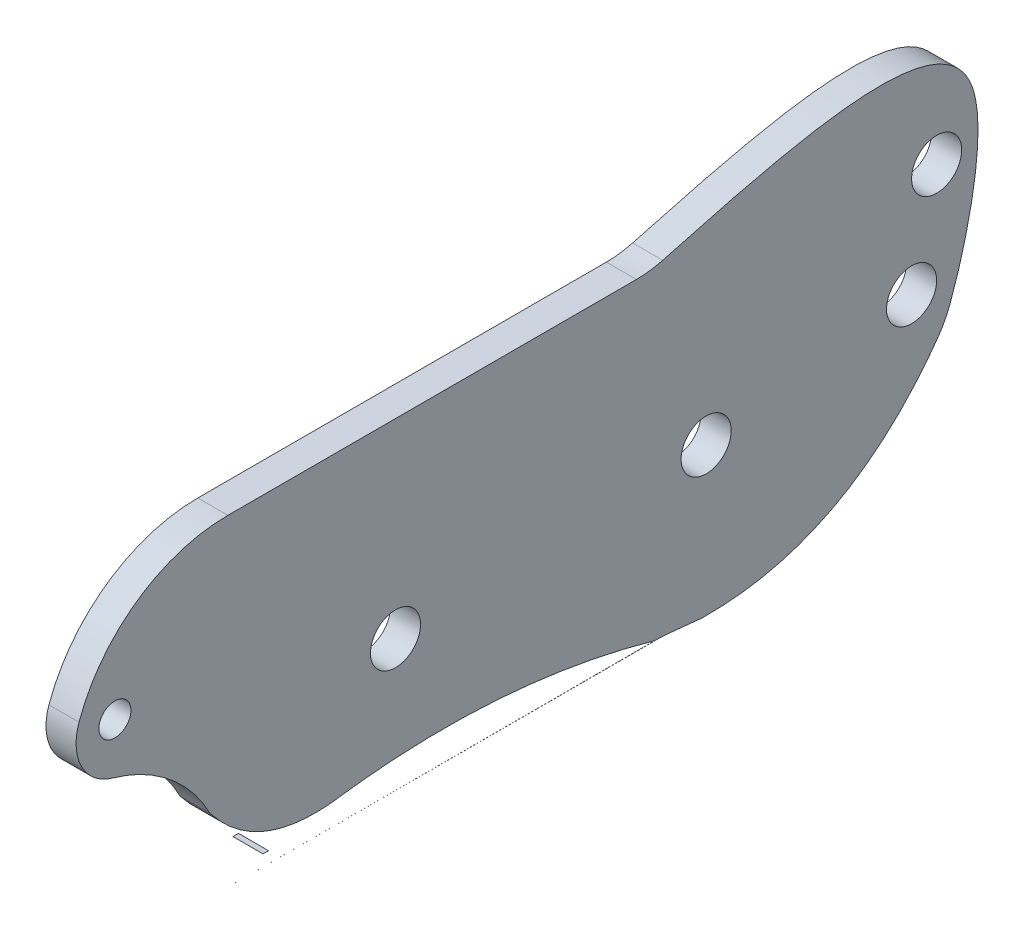
ISO-10303-21;
HEADER;
FILE_DESCRIPTION(('STEP AP214'),'2;1');
FILE_NAME('part.step','',(''),(''),'','','');
FILE_SCHEMA(('AUTOMOTIVE_DESIGN { 1 0 10303 214 1 1 1 1 }'));
ENDSEC;
DATA;
#1=APPLICATION_CONTEXT('core data for automotive mechanical design processes');
#2=APPLICATION_PROTOCOL_DEFINITION('international standard','automotive_design',2000,#1);
#3=PRODUCT_CONTEXT('',#1,'mechanical');
#4=PRODUCT('Part','Part','',(#3));
#5=PRODUCT_RELATED_PRODUCT_CATEGORY('part','',(#4));
#6=PRODUCT_DEFINITION_FORMATION('','',#4);
#7=PRODUCT_DEFINITION_CONTEXT('part definition',#1,'design');
#8=PRODUCT_DEFINITION('design','',#6,#7);
#9=PRODUCT_DEFINITION_SHAPE('','',#8);
#10=(LENGTH_UNIT() NAMED_UNIT(*) SI_UNIT(.MILLI.,.METRE.));
#11=(NAMED_UNIT(*) PLANE_ANGLE_UNIT() SI_UNIT($,.RADIAN.));
#12=(NAMED_UNIT(*) SI_UNIT($,.STERADIAN.) SOLID_ANGLE_UNIT());
#13=UNCERTAINTY_MEASURE_WITH_UNIT(LENGTH_MEASURE(1.E-05),#10,'distance_accuracy_value','');
#14=(GEOMETRIC_REPRESENTATION_CONTEXT(3) GLOBAL_UNCERTAINTY_ASSIGNED_CONTEXT((#13)) GLOBAL_UNIT_ASSIGNED_CONTEXT((#10,
#11,#12)) REPRESENTATION_CONTEXT('',''));
#15=CARTESIAN_POINT('',(0.,0.,0.));
#16=DIRECTION('',(0.,0.,1.));
#17=DIRECTION('',(1.,0.,0.));
#18=AXIS2_PLACEMENT_3D('',#15,#16,#17);
#19=CARTESIAN_POINT('',(3.,-32.1444743553119,1.14491749414469E-13));
#20=DIRECTION('',(-1.,0.,0.));
#21=DIRECTION('',(0.,0.,1.));
#22=AXIS2_PLACEMENT_3D('',#19,#20,#21);
#23=CYLINDRICAL_SURFACE('',#22,15.7821119433798);
#24=CARTESIAN_POINT('',(0.,-32.1444743553119,1.14491749414469E-13));
#25=DIRECTION('',(-1.,0.,0.));
#26=DIRECTION('',(0.,0.,-1.));
#27=AXIS2_PLACEMENT_3D('',#24,#25,#26);
#28=CIRCLE('',#27,15.7821119433798);
#29=CARTESIAN_POINT('',(0.,-16.9532882843979,-4.27819157498098));
#30=VERTEX_POINT('',#29);
#31=CARTESIAN_POINT('',(0.,-24.8780526474352,-14.0097884693762));
#32=VERTEX_POINT('',#31);
#33=EDGE_CURVE('E70',#30,#32,#28,.T.);
#34=ORIENTED_EDGE('',*,*,#33,.T.);
#35=DIRECTION('',(-1.,0.,0.));
#36=VECTOR('',#35,1.);
#37=CARTESIAN_POINT('',(3.00900035337785,-24.8780526474352,-14.0097884693762));
#38=LINE('',#37,#36);
#39=CARTESIAN_POINT('',(3.,-24.8780526474349,-14.0097884693759));
#40=VERTEX_POINT('',#39);
#41=EDGE_CURVE('E158',#32,#40,#38,.F.);
#42=ORIENTED_EDGE('',*,*,#41,.T.);
#43=CARTESIAN_POINT('',(3.,-32.1444743553119,1.14491749414469E-13));
#44=DIRECTION('',(-1.,0.,0.));
#45=DIRECTION('',(0.,0.,-1.));
#46=AXIS2_PLACEMENT_3D('',#43,#44,#45);
#47=CIRCLE('',#46,15.7821119433798);
#48=CARTESIAN_POINT('',(3.,-16.9532882843979,-4.27819157498098));
#49=VERTEX_POINT('',#48);
#50=EDGE_CURVE('E79',#49,#40,#47,.T.);
#51=ORIENTED_EDGE('',*,*,#50,.F.);
#52=DIRECTION('',(-1.,0.,0.));
#53=VECTOR('',#52,1.);
#54=CARTESIAN_POINT('',(3.,-16.9532882843979,-4.27819157498098));
#55=LINE('',#54,#53);
#56=EDGE_CURVE('E314',#49,#30,#55,.T.);
#57=ORIENTED_EDGE('',*,*,#56,.T.);
#58=EDGE_LOOP('',(#34,#42,#51,#57));
#59=FACE_BOUND('',#58,.T.);
#60=ADVANCED_FACE('F52',(#59),#23,.F.);
#61=CARTESIAN_POINT('',(0.,-32.1356776402174,-58.4113438615279));
#62=CARTESIAN_POINT('',(0.,-26.2601469590755,-37.6613027874173));
#63=CARTESIAN_POINT('',(0.,-32.1444743553118,-15.7821119433797));
#64=B_SPLINE_CURVE_WITH_KNOTS('',2,(#61,#62,#63),.UNSPECIFIED.,.F.,.F.,(3,3),(0.,1.),.UNSPECIFIED.);
#65=DIRECTION('',(1.,0.,0.));
#66=VECTOR('',#65,1.);
#67=SURFACE_OF_LINEAR_EXTRUSION('',#64,#66);
#68=CARTESIAN_POINT('',(3.,-32.1356776402174,-58.4113438615279));
#69=CARTESIAN_POINT('',(3.,-26.2601469590755,-37.6613027874173));
#70=CARTESIAN_POINT('',(3.,-32.1444743553118,-15.7821119433797));
#71=B_SPLINE_CURVE_WITH_KNOTS('',2,(#68,#69,#70),.UNSPECIFIED.,.F.,.F.,(3,3),(0.,1.),.UNSPECIFIED.);
#72=CARTESIAN_POINT('',(3.,-32.1356776402174,-58.4113438615279));
#73=VERTEX_POINT('',#72);
#74=CARTESIAN_POINT('',(3.,-29.8501550964413,-27.3101913273094));
#75=VERTEX_POINT('',#74);
#76=EDGE_CURVE('E152',#73,#75,#71,.T.);
#77=ORIENTED_EDGE('',*,*,#76,.T.);
#78=CARTESIAN_POINT('',(3.,-29.8501550964413,-27.3101913273094));
#79=CARTESIAN_POINT('',(3.,-29.910526915623,-26.8389903539469));
#80=CARTESIAN_POINT('',(3.,-29.9765056621349,-26.3672510185851));
#81=B_SPLINE_CURVE_WITH_KNOTS('',2,(#78,#79,#80),.UNSPECIFIED.,.F.,.F.,(3,3),(0.734735799910028,
0.756571213550189),.UNSPECIFIED.);
#82=CARTESIAN_POINT('',(3.,-29.9765056621349,-26.3672510185851));
#83=VERTEX_POINT('',#82);
#84=EDGE_CURVE('E148',#75,#83,#81,.T.);
#85=ORIENTED_EDGE('',*,*,#84,.T.);
#86=DIRECTION('',(-1.,0.,0.));
#87=VECTOR('',#86,1.);
#88=CARTESIAN_POINT('',(3.00900035337785,-29.9765056621349,-26.3672510185851));
#89=LINE('',#88,#87);
#90=CARTESIAN_POINT('',(0.,-29.9765056610089,-26.3672510266359));
#91=VERTEX_POINT('',#90);
#92=EDGE_CURVE('E157',#83,#91,#89,.T.);
#93=ORIENTED_EDGE('',*,*,#92,.T.);
#94=CARTESIAN_POINT('',(0.,-32.1356776402174,-58.4113438615279));
#95=VERTEX_POINT('',#94);
#96=EDGE_CURVE('E246',#95,#91,#64,.T.);
#97=ORIENTED_EDGE('',*,*,#96,.F.);
#98=DIRECTION('',(1.,0.,0.));
#99=VECTOR('',#98,1.);
#100=CARTESIAN_POINT('',(0.,-32.1356776402174,-58.4113438615279));
#101=LINE('',#100,#99);
#102=EDGE_CURVE('E163',#95,#73,#101,.T.);
#103=ORIENTED_EDGE('',*,*,#102,.T.);
#104=EDGE_LOOP('',(#77,#85,#93,#97,#103));
#105=FACE_BOUND('',#104,.T.);
#106=ADVANCED_FACE('F161',(#105),#67,.F.);
#107=CARTESIAN_POINT('',(3.,-16.3623624119322,-57.8844813533615));
#108=DIRECTION('',(1.,0.,0.));
#109=DIRECTION('',(0.,0.,-1.));
#110=AXIS2_PLACEMENT_3D('',#107,#108,#109);
#111=PLANE('',#110);
#112=CARTESIAN_POINT('',(3.,-15.0490269286293,-84.0097884693759));
#113=DIRECTION('',(1.,0.,0.));
#114=DIRECTION('',(0.,0.,-1.));
#115=AXIS2_PLACEMENT_3D('',#112,#113,#114);
#116=CIRCLE('',#115,2.49999999999999);
#117=CARTESIAN_POINT('',(3.,-15.0490269286293,-86.5097884693759));
#118=VERTEX_POINT('',#117);
#119=EDGE_CURVE('E279',#118,#118,#116,.T.);
#120=ORIENTED_EDGE('',*,*,#119,.F.);
#121=EDGE_LOOP('',(#120));
#122=FACE_BOUND('',#121,.T.);
#123=CARTESIAN_POINT('',(3.,-19.028525858928,-32.5097884693759));
#124=DIRECTION('',(1.,0.,0.));
#125=DIRECTION('',(0.,0.,-1.));
#126=AXIS2_PLACEMENT_3D('',#123,#124,#125);
#127=CIRCLE('',#126,2.5);
#128=CARTESIAN_POINT('',(3.,-19.028525858928,-35.0097884693759));
#129=VERTEX_POINT('',#128);
#130=EDGE_CURVE('E273',#129,#129,#127,.T.);
#131=ORIENTED_EDGE('',*,*,#130,.F.);
#132=EDGE_LOOP('',(#131));
#133=FACE_BOUND('',#132,.T.);
#134=CARTESIAN_POINT('',(3.,-17.778525858928,-63.5097884693759));
#135=DIRECTION('',(1.,0.,0.));
#136=DIRECTION('',(0.,0.,-1.));
#137=AXIS2_PLACEMENT_3D('',#134,#135,#136);
#138=CIRCLE('',#137,2.49999999999999);
#139=CARTESIAN_POINT('',(3.,-17.778525858928,-66.0097884693759));
#140=VERTEX_POINT('',#139);
#141=EDGE_CURVE('E265',#140,#140,#138,.T.);
#142=ORIENTED_EDGE('',*,*,#141,.F.);
#143=EDGE_LOOP('',(#142));
#144=FACE_BOUND('',#143,.T.);
#145=CARTESIAN_POINT('',(3.,-11.996404602197,-4.50978846937593));
#146=DIRECTION('',(1.,0.,0.));
#147=DIRECTION('',(0.,0.,-1.));
#148=AXIS2_PLACEMENT_3D('',#145,#146,#147);
#149=CIRCLE('',#148,1.6);
#150=CARTESIAN_POINT('',(3.,-11.996404602197,-6.10978846937593));
#151=VERTEX_POINT('',#150);
#152=EDGE_CURVE('E262',#151,#151,#149,.T.);
#153=ORIENTED_EDGE('',*,*,#152,.F.);
#154=EDGE_LOOP('',(#153));
#155=FACE_BOUND('',#154,.T.);
#156=CARTESIAN_POINT('',(3.,-5.02852585892804,-86.5097884693759));
#157=DIRECTION('',(1.,0.,0.));
#158=DIRECTION('',(0.,0.,-1.));
#159=AXIS2_PLACEMENT_3D('',#156,#157,#158);
#160=CIRCLE('',#159,2.5);
#161=CARTESIAN_POINT('',(3.,-5.02852585892804,-89.0097884693759));
#162=VERTEX_POINT('',#161);
#163=EDGE_CURVE('E251',#162,#162,#160,.T.);
#164=ORIENTED_EDGE('',*,*,#163,.F.);
#165=EDGE_LOOP('',(#164));
#166=FACE_BOUND('',#165,.T.);
#167=CARTESIAN_POINT('',(3.,-22.2448675699933,-12.2911693052142));
#168=CARTESIAN_POINT('',(3.,-31.4276918674506,-17.3411433747541));
#169=CARTESIAN_POINT('',(3.,-29.8501507899768,-27.3102249397086));
#170=B_SPLINE_CURVE_WITH_KNOTS('',2,(#167,#168,#169),.UNSPECIFIED.,.F.,.F.,(3,3),(0.,1.),.UNSPECIFIED.);
#171=EDGE_CURVE('E13',#83,#40,#170,.F.);
#172=ORIENTED_EDGE('',*,*,#171,.F.);
#173=ORIENTED_EDGE('',*,*,#84,.F.);
#174=ORIENTED_EDGE('',*,*,#76,.F.);
#175=CARTESIAN_POINT('',(3.,-42.1333095430407,-58.6289589704921));
#176=DIRECTION('',(1.,0.,0.));
#177=DIRECTION('',(0.,0.,-1.));
#178=AXIS2_PLACEMENT_3D('',#175,#176,#177);
#179=CIRCLE('',#178,10.);
#180=CARTESIAN_POINT('',(3.,-32.1895694838639,-59.6882198616429));
#181=VERTEX_POINT('',#180);
#182=EDGE_CURVE('E164',#73,#181,#179,.F.);
#183=ORIENTED_EDGE('',*,*,#182,.T.);
#184=CARTESIAN_POINT('',(3.,0.,-57.8844813533614));
#185=CARTESIAN_POINT('',(3.,3.96506314049984,-72.4697070885256));
#186=CARTESIAN_POINT('',(3.,9.39071824137526,-92.4276249332934));
#187=CARTESIAN_POINT('',(3.,-16.1793130097914,-89.6942745472634));
#188=CARTESIAN_POINT('',(3.,-34.4258267328282,-80.5564961166921));
#189=CARTESIAN_POINT('',(3.,-32.8270484479734,-65.6359901461603));
#190=CARTESIAN_POINT('',(3.,-32.1092973012512,-58.9376190390007));
#191=B_SPLINE_CURVE_WITH_KNOTS('',3,(#184,#185,#186,#187,#188,#189,#190),.UNSPECIFIED.,.F.,.F.,
(4,1,1,1,4),(0.,0.376783583733936,0.5155776088737,0.782524737781,1.),.UNSPECIFIED.);
#192=CARTESIAN_POINT('',(3.,-32.528525858928,-63.1029357809287));
#193=VERTEX_POINT('',#192);
#194=EDGE_CURVE('E187',#193,#181,#191,.T.);
#195=ORIENTED_EDGE('',*,*,#194,.F.);
#196=CARTESIAN_POINT('',(3.,-32.1356776402174,-58.4113438615279));
#197=CARTESIAN_POINT('',(3.,-34.8482096110882,-76.7305716450905));
#198=CARTESIAN_POINT('',(3.,-19.0176348210288,-87.3587036245105));
#199=B_SPLINE_CURVE_WITH_KNOTS('',2,(#196,#197,#198),.UNSPECIFIED.,.F.,.F.,(3,3),(0.,1.),.UNSPECIFIED.);
#200=CARTESIAN_POINT('',(3.,-20.1208711896773,-86.5925205196383));
#201=VERTEX_POINT('',#200);
#202=EDGE_CURVE('E166',#193,#201,#199,.T.);
#203=ORIENTED_EDGE('',*,*,#202,.T.);
#204=CARTESIAN_POINT('',(3.,-14.285250462083,-78.4718351591732));
#205=DIRECTION('',(1.,0.,0.));
#206=DIRECTION('',(0.,0.,-1.));
#207=AXIS2_PLACEMENT_3D('',#204,#205,#206);
#208=CIRCLE('',#207,10.);
#209=CARTESIAN_POINT('',(3.,-17.7649772351603,-87.8468819102422));
#210=VERTEX_POINT('',#209);
#211=EDGE_CURVE('E326',#201,#210,#208,.T.);
#212=ORIENTED_EDGE('',*,*,#211,.T.);
#213=CARTESIAN_POINT('',(3.,0.348966370012304,-59.168944813152));
#214=VERTEX_POINT('',#213);
#215=EDGE_CURVE('E176',#214,#210,#191,.T.);
#216=ORIENTED_EDGE('',*,*,#215,.F.);
#217=CARTESIAN_POINT('',(3.,10.,-56.5502524156287));
#218=DIRECTION('',(1.,0.,0.));
#219=DIRECTION('',(0.,0.,-1.));
#220=AXIS2_PLACEMENT_3D('',#217,#218,#219);
#221=CIRCLE('',#220,10.);
#222=CARTESIAN_POINT('',(3.,0.,-56.5502524156286));
#223=VERTEX_POINT('',#222);
#224=EDGE_CURVE('E357',#214,#223,#221,.F.);
#225=ORIENTED_EDGE('',*,*,#224,.T.);
#226=DIRECTION('',(0.,0.,1.));
#227=VECTOR('',#226,1.);
#228=CARTESIAN_POINT('',(3.,0.,-15.7821119433797));
#229=LINE('',#228,#227);
#230=CARTESIAN_POINT('',(3.,0.,-15.7821119433797));
#231=VERTEX_POINT('',#230);
#232=EDGE_CURVE('E356',#223,#231,#229,.T.);
#233=ORIENTED_EDGE('',*,*,#232,.T.);
#234=CARTESIAN_POINT('',(3.,-15.7821119433796,-15.7821119433796));
#235=DIRECTION('',(1.,0.,0.));
#236=DIRECTION('',(0.,0.,-1.));
#237=AXIS2_PLACEMENT_3D('',#234,#235,#236);
#238=CIRCLE('',#237,15.7821119433796);
#239=CARTESIAN_POINT('',(3.,-10.4517745719086,-0.92739683673199));
#240=VERTEX_POINT('',#239);
#241=EDGE_CURVE('E309',#231,#240,#238,.T.);
#242=ORIENTED_EDGE('',*,*,#241,.T.);
#243=CARTESIAN_POINT('',(3.,-12.1405020979185,-5.63358418350182));
#244=DIRECTION('',(1.,0.,0.));
#245=DIRECTION('',(0.,0.,-1.));
#246=AXIS2_PLACEMENT_3D('',#243,#244,#245);
#247=CIRCLE('',#246,5.);
#248=EDGE_CURVE('E307',#240,#49,#247,.T.);
#249=ORIENTED_EDGE('',*,*,#248,.T.);
#250=ORIENTED_EDGE('',*,*,#50,.T.);
#251=EDGE_LOOP('',(#172,#173,#174,#183,#195,#203,#212,#216,#225,#233,#242,#249,#250));
#252=FACE_BOUND('',#251,.T.);
#253=ADVANCED_FACE('F54',(#122,#133,#144,#155,#166,#252),#111,.T.);
#254=CARTESIAN_POINT('',(0.,-16.3623624119322,-57.8844813533615));
#255=DIRECTION('',(1.,0.,0.));
#256=DIRECTION('',(0.,0.,-1.));
#257=AXIS2_PLACEMENT_3D('',#254,#255,#256);
#258=PLANE('',#257);
#259=CARTESIAN_POINT('',(0.,-15.0490269286293,-84.0097884693759));
#260=DIRECTION('',(-1.,0.,0.));
#261=DIRECTION('',(0.,0.,1.));
#262=AXIS2_PLACEMENT_3D('',#259,#260,#261);
#263=CIRCLE('',#262,2.49999999999999);
#264=CARTESIAN_POINT('',(0.,-15.0490269286293,-81.5097884693759));
#265=VERTEX_POINT('',#264);
#266=EDGE_CURVE('E282',#265,#265,#263,.T.);
#267=ORIENTED_EDGE('',*,*,#266,.F.);
#268=EDGE_LOOP('',(#267));
#269=FACE_BOUND('',#268,.T.);
#270=CARTESIAN_POINT('',(0.,-19.028525858928,-32.5097884693759));
#271=DIRECTION('',(-1.,0.,0.));
#272=DIRECTION('',(0.,0.,1.));
#273=AXIS2_PLACEMENT_3D('',#270,#271,#272);
#274=CIRCLE('',#273,2.5);
#275=CARTESIAN_POINT('',(0.,-19.028525858928,-30.0097884693759));
#276=VERTEX_POINT('',#275);
#277=EDGE_CURVE('E276',#276,#276,#274,.T.);
#278=ORIENTED_EDGE('',*,*,#277,.F.);
#279=EDGE_LOOP('',(#278));
#280=FACE_BOUND('',#279,.T.);
#281=CARTESIAN_POINT('',(0.,-17.778525858928,-63.5097884693759));
#282=DIRECTION('',(-1.,0.,0.));
#283=DIRECTION('',(0.,0.,1.));
#284=AXIS2_PLACEMENT_3D('',#281,#282,#283);
#285=CIRCLE('',#284,2.49999999999999);
#286=CARTESIAN_POINT('',(0.,-17.778525858928,-61.0097884693759));
#287=VERTEX_POINT('',#286);
#288=EDGE_CURVE('E270',#287,#287,#285,.T.);
#289=ORIENTED_EDGE('',*,*,#288,.F.);
#290=EDGE_LOOP('',(#289));
#291=FACE_BOUND('',#290,.T.);
#292=CARTESIAN_POINT('',(0.,-11.996404602197,-4.50978846937593));
#293=DIRECTION('',(1.,0.,0.));
#294=DIRECTION('',(0.,0.,-1.));
#295=AXIS2_PLACEMENT_3D('',#292,#293,#294);
#296=CIRCLE('',#295,1.6);
#297=CARTESIAN_POINT('',(0.,-11.996404602197,-6.10978846937593));
#298=VERTEX_POINT('',#297);
#299=EDGE_CURVE('E261',#298,#298,#296,.T.);
#300=ORIENTED_EDGE('',*,*,#299,.T.);
#301=EDGE_LOOP('',(#300));
#302=FACE_BOUND('',#301,.T.);
#303=CARTESIAN_POINT('',(0.,-5.02852585892804,-86.5097884693759));
#304=DIRECTION('',(1.,0.,0.));
#305=DIRECTION('',(0.,0.,-1.));
#306=AXIS2_PLACEMENT_3D('',#303,#304,#305);
#307=CIRCLE('',#306,2.5);
#308=CARTESIAN_POINT('',(0.,-5.02852585892804,-89.0097884693759));
#309=VERTEX_POINT('',#308);
#310=EDGE_CURVE('E57',#309,#309,#307,.T.);
#311=ORIENTED_EDGE('',*,*,#310,.T.);
#312=EDGE_LOOP('',(#311));
#313=FACE_BOUND('',#312,.T.);
#314=ORIENTED_EDGE('',*,*,#96,.T.);
#315=CARTESIAN_POINT('',(0.,-22.2448675699933,-12.2911693052142));
#316=CARTESIAN_POINT('',(0.,-31.4276918674506,-17.3411433747541));
#317=CARTESIAN_POINT('',(0.,-29.8501507899768,-27.3102249397086));
#318=B_SPLINE_CURVE_WITH_KNOTS('',2,(#315,#316,#317),.UNSPECIFIED.,.F.,.F.,(3,3),(0.,1.),.UNSPECIFIED.);
#319=EDGE_CURVE('E62',#32,#91,#318,.T.);
#320=ORIENTED_EDGE('',*,*,#319,.F.);
#321=ORIENTED_EDGE('',*,*,#33,.F.);
#322=CARTESIAN_POINT('',(0.,-12.1405020979185,-5.63358418350182));
#323=DIRECTION('',(1.,0.,0.));
#324=DIRECTION('',(0.,0.,-1.));
#325=AXIS2_PLACEMENT_3D('',#322,#323,#324);
#326=CIRCLE('',#325,5.);
#327=CARTESIAN_POINT('',(0.,-10.4517745719086,-0.92739683673199));
#328=VERTEX_POINT('',#327);
#329=EDGE_CURVE('E304',#30,#328,#326,.F.);
#330=ORIENTED_EDGE('',*,*,#329,.T.);
#331=CARTESIAN_POINT('',(0.,-15.7821119433796,-15.7821119433796));
#332=DIRECTION('',(1.,0.,0.));
#333=DIRECTION('',(0.,0.,-1.));
#334=AXIS2_PLACEMENT_3D('',#331,#332,#333);
#335=CIRCLE('',#334,15.7821119433796);
#336=CARTESIAN_POINT('',(0.,0.,-15.7821119433797));
#337=VERTEX_POINT('',#336);
#338=EDGE_CURVE('E345',#337,#328,#335,.T.);
#339=ORIENTED_EDGE('',*,*,#338,.F.);
#340=DIRECTION('',(0.,0.,1.));
#341=VECTOR('',#340,1.);
#342=CARTESIAN_POINT('',(0.,0.,-15.7821119433797));
#343=LINE('',#342,#341);
#344=CARTESIAN_POINT('',(0.,0.,-56.5502524156286));
#345=VERTEX_POINT('',#344);
#346=EDGE_CURVE('E351',#345,#337,#343,.T.);
#347=ORIENTED_EDGE('',*,*,#346,.F.);
#348=CARTESIAN_POINT('',(0.,10.,-56.5502524156287));
#349=DIRECTION('',(1.,0.,0.));
#350=DIRECTION('',(0.,0.,-1.));
#351=AXIS2_PLACEMENT_3D('',#348,#349,#350);
#352=CIRCLE('',#351,10.);
#353=CARTESIAN_POINT('',(0.,0.348966370012304,-59.168944813152));
#354=VERTEX_POINT('',#353);
#355=EDGE_CURVE('E305',#345,#354,#352,.T.);
#356=ORIENTED_EDGE('',*,*,#355,.T.);
#357=CARTESIAN_POINT('',(0.,0.,-57.8844813533614));
#358=CARTESIAN_POINT('',(0.,3.96506314049984,-72.4697070885256));
#359=CARTESIAN_POINT('',(0.,9.39071824137526,-92.4276249332934));
#360=CARTESIAN_POINT('',(0.,-16.1793130097914,-89.6942745472634));
#361=CARTESIAN_POINT('',(0.,-34.4258267328282,-80.5564961166921));
#362=CARTESIAN_POINT('',(0.,-32.8270484479734,-65.6359901461603));
#363=CARTESIAN_POINT('',(0.,-32.1092973012512,-58.9376190390007));
#364=B_SPLINE_CURVE_WITH_KNOTS('',3,(#357,#358,#359,#360,#361,#362,#363),.UNSPECIFIED.,.F.,.F.,
(4,1,1,1,4),(0.,0.376783583733936,0.5155776088737,0.782524737781,1.),.UNSPECIFIED.);
#365=CARTESIAN_POINT('',(0.,-17.7649772351603,-87.8468819102422));
#366=VERTEX_POINT('',#365);
#367=EDGE_CURVE('E188',#354,#366,#364,.T.);
#368=ORIENTED_EDGE('',*,*,#367,.T.);
#369=CARTESIAN_POINT('',(0.,-14.285250462083,-78.4718351591732));
#370=DIRECTION('',(1.,0.,0.));
#371=DIRECTION('',(0.,0.,-1.));
#372=AXIS2_PLACEMENT_3D('',#369,#370,#371);
#373=CIRCLE('',#372,10.);
#374=CARTESIAN_POINT('',(0.,-20.1208711896773,-86.5925205196383));
#375=VERTEX_POINT('',#374);
#376=EDGE_CURVE('E414',#366,#375,#373,.F.);
#377=ORIENTED_EDGE('',*,*,#376,.T.);
#378=CARTESIAN_POINT('',(0.,-32.1356776402174,-58.4113438615279));
#379=CARTESIAN_POINT('',(0.,-34.8482096110882,-76.7305716450905));
#380=CARTESIAN_POINT('',(0.,-19.0176348210288,-87.3587036245105));
#381=B_SPLINE_CURVE_WITH_KNOTS('',2,(#378,#379,#380),.UNSPECIFIED.,.F.,.F.,(3,3),(0.,1.),.UNSPECIFIED.);
#382=CARTESIAN_POINT('',(0.,-32.528525858928,-63.1029357809287));
#383=VERTEX_POINT('',#382);
#384=EDGE_CURVE('E250',#383,#375,#381,.T.);
#385=ORIENTED_EDGE('',*,*,#384,.F.);
#386=CARTESIAN_POINT('',(0.,-32.1895694838622,-59.6882198616275));
#387=VERTEX_POINT('',#386);
#388=EDGE_CURVE('E415',#383,#387,#364,.T.);
#389=ORIENTED_EDGE('',*,*,#388,.T.);
#390=CARTESIAN_POINT('',(0.,-42.1333095430407,-58.6289589704921));
#391=DIRECTION('',(1.,0.,0.));
#392=DIRECTION('',(0.,0.,-1.));
#393=AXIS2_PLACEMENT_3D('',#390,#391,#392);
#394=CIRCLE('',#393,10.);
#395=EDGE_CURVE('E303',#387,#95,#394,.T.);
#396=ORIENTED_EDGE('',*,*,#395,.T.);
#397=EDGE_LOOP('',(#314,#320,#321,#330,#339,#347,#356,#368,#377,#385,#389,#396));
#398=FACE_BOUND('',#397,.T.);
#399=ADVANCED_FACE('F201',(#269,#280,#291,#302,#313,#398),#258,.F.);
#400=DIRECTION('',(-1.,0.,0.));
#401=VECTOR('',#400,1.);
#402=SURFACE_OF_LINEAR_EXTRUSION('',#191,#401);
#403=ORIENTED_EDGE('',*,*,#388,.F.);
#404=DIRECTION('',(1.,0.,0.));
#405=VECTOR('',#404,1.);
#406=CARTESIAN_POINT('',(-125.897209906755,-32.5285258589289,-63.1029357809287));
#407=LINE('',#406,#405);
#408=EDGE_CURVE('E229',#383,#193,#407,.T.);
#409=ORIENTED_EDGE('',*,*,#408,.T.);
#410=ORIENTED_EDGE('',*,*,#194,.T.);
#411=DIRECTION('',(-1.,0.,0.));
#412=VECTOR('',#411,1.);
#413=CARTESIAN_POINT('',(3.,-32.1895694838639,-59.6882198616429));
#414=LINE('',#413,#412);
#415=EDGE_CURVE('E186',#181,#387,#414,.T.);
#416=ORIENTED_EDGE('',*,*,#415,.T.);
#417=EDGE_LOOP('',(#403,#409,#410,#416));
#418=FACE_BOUND('',#417,.T.);
#419=ADVANCED_FACE('F196',(#418),#402,.T.);
#420=ORIENTED_EDGE('',*,*,#215,.T.);
#421=DIRECTION('',(-1.,0.,0.));
#422=VECTOR('',#421,1.);
#423=CARTESIAN_POINT('',(3.,-17.7649772351603,-87.8468819102422));
#424=LINE('',#423,#422);
#425=EDGE_CURVE('E185',#210,#366,#424,.T.);
#426=ORIENTED_EDGE('',*,*,#425,.T.);
#427=ORIENTED_EDGE('',*,*,#367,.F.);
#428=DIRECTION('',(-1.,0.,0.));
#429=VECTOR('',#428,1.);
#430=CARTESIAN_POINT('',(0.,0.348966370012305,-59.168944813152));
#431=LINE('',#430,#429);
#432=EDGE_CURVE('E367',#354,#214,#431,.F.);
#433=ORIENTED_EDGE('',*,*,#432,.T.);
#434=EDGE_LOOP('',(#420,#426,#427,#433));
#435=FACE_BOUND('',#434,.T.);
#436=ADVANCED_FACE('F200',(#435),#402,.T.);
#437=CARTESIAN_POINT('',(3.,0.,-15.7821119433797));
#438=DIRECTION('',(0.,-1.,0.));
#439=DIRECTION('',(0.,0.,-1.));
#440=AXIS2_PLACEMENT_3D('',#437,#438,#439);
#441=PLANE('',#440);
#442=ORIENTED_EDGE('',*,*,#232,.F.);
#443=DIRECTION('',(-1.,0.,0.));
#444=VECTOR('',#443,1.);
#445=CARTESIAN_POINT('',(3.,0.,-56.5502524156287));
#446=LINE('',#445,#444);
#447=EDGE_CURVE('E353',#223,#345,#446,.T.);
#448=ORIENTED_EDGE('',*,*,#447,.T.);
#449=ORIENTED_EDGE('',*,*,#346,.T.);
#450=DIRECTION('',(-1.,0.,0.));
#451=VECTOR('',#450,1.);
#452=CARTESIAN_POINT('',(3.,0.,-15.7821119433797));
#453=LINE('',#452,#451);
#454=EDGE_CURVE('E319',#231,#337,#453,.T.);
#455=ORIENTED_EDGE('',*,*,#454,.F.);
#456=EDGE_LOOP('',(#442,#448,#449,#455));
#457=FACE_BOUND('',#456,.T.);
#458=ADVANCED_FACE('F212',(#457),#441,.F.);
#459=CARTESIAN_POINT('',(3.,-15.7821119433796,-15.7821119433796));
#460=DIRECTION('',(-1.,0.,0.));
#461=DIRECTION('',(0.,0.,1.));
#462=AXIS2_PLACEMENT_3D('',#459,#460,#461);
#463=CYLINDRICAL_SURFACE('',#462,15.7821119433796);
#464=ORIENTED_EDGE('',*,*,#338,.T.);
#465=DIRECTION('',(-1.,0.,0.));
#466=VECTOR('',#465,1.);
#467=CARTESIAN_POINT('',(3.,-10.4517745719086,-0.92739683673199));
#468=LINE('',#467,#466);
#469=EDGE_CURVE('E344',#328,#240,#468,.F.);
#470=ORIENTED_EDGE('',*,*,#469,.T.);
#471=ORIENTED_EDGE('',*,*,#241,.F.);
#472=ORIENTED_EDGE('',*,*,#454,.T.);
#473=EDGE_LOOP('',(#464,#470,#471,#472));
#474=FACE_BOUND('',#473,.T.);
#475=ADVANCED_FACE('F208',(#474),#463,.T.);
#476=CARTESIAN_POINT('',(1.5,10.,-56.5502524156287));
#477=DIRECTION('',(-1.,0.,0.));
#478=DIRECTION('',(0.,0.,1.));
#479=AXIS2_PLACEMENT_3D('',#476,#477,#478);
#480=CYLINDRICAL_SURFACE('',#479,10.);
#481=ORIENTED_EDGE('',*,*,#224,.F.);
#482=ORIENTED_EDGE('',*,*,#432,.F.);
#483=ORIENTED_EDGE('',*,*,#355,.F.);
#484=ORIENTED_EDGE('',*,*,#447,.F.);
#485=EDGE_LOOP('',(#481,#482,#483,#484));
#486=FACE_BOUND('',#485,.T.);
#487=ADVANCED_FACE('F211',(#486),#480,.F.);
#488=CARTESIAN_POINT('',(1.5,-42.1333095430407,-58.6289589704921));
#489=DIRECTION('',(-1.,0.,0.));
#490=DIRECTION('',(0.,0.,1.));
#491=AXIS2_PLACEMENT_3D('',#488,#489,#490);
#492=CYLINDRICAL_SURFACE('',#491,10.);
#493=ORIENTED_EDGE('',*,*,#182,.F.);
#494=ORIENTED_EDGE('',*,*,#102,.F.);
#495=ORIENTED_EDGE('',*,*,#395,.F.);
#496=ORIENTED_EDGE('',*,*,#415,.F.);
#497=EDGE_LOOP('',(#493,#494,#495,#496));
#498=FACE_BOUND('',#497,.T.);
#499=ADVANCED_FACE('F404',(#498),#492,.F.);
#500=CARTESIAN_POINT('',(3.,-12.1405020979185,-5.63358418350182));
#501=DIRECTION('',(1.,0.,0.));
#502=DIRECTION('',(0.,0.,-1.));
#503=AXIS2_PLACEMENT_3D('',#500,#501,#502);
#504=CYLINDRICAL_SURFACE('',#503,5.);
#505=ORIENTED_EDGE('',*,*,#248,.F.);
#506=ORIENTED_EDGE('',*,*,#469,.F.);
#507=ORIENTED_EDGE('',*,*,#329,.F.);
#508=ORIENTED_EDGE('',*,*,#56,.F.);
#509=EDGE_LOOP('',(#505,#506,#507,#508));
#510=FACE_BOUND('',#509,.T.);
#511=ADVANCED_FACE('F222',(#510),#504,.T.);
#512=CARTESIAN_POINT('',(-125.897209906755,-32.1356776402174,-58.4113438615279));
#513=CARTESIAN_POINT('',(-125.897209906755,-34.8482096110882,-76.7305716450905));
#514=CARTESIAN_POINT('',(-125.897209906755,-19.0176348210288,-87.3587036245105));
#515=B_SPLINE_CURVE_WITH_KNOTS('',2,(#512,#513,#514),.UNSPECIFIED.,.F.,.F.,(3,3),(0.,1.),.UNSPECIFIED.);
#516=DIRECTION('',(1.,0.,0.));
#517=VECTOR('',#516,1.);
#518=SURFACE_OF_LINEAR_EXTRUSION('',#515,#517);
#519=ORIENTED_EDGE('',*,*,#384,.T.);
#520=DIRECTION('',(1.,0.,0.));
#521=VECTOR('',#520,1.);
#522=CARTESIAN_POINT('',(0.,-20.1208711896773,-86.5925205196383));
#523=LINE('',#522,#521);
#524=EDGE_CURVE('E333',#375,#201,#523,.T.);
#525=ORIENTED_EDGE('',*,*,#524,.T.);
#526=ORIENTED_EDGE('',*,*,#202,.F.);
#527=ORIENTED_EDGE('',*,*,#408,.F.);
#528=EDGE_LOOP('',(#519,#525,#526,#527));
#529=FACE_BOUND('',#528,.T.);
#530=ADVANCED_FACE('F217',(#529),#518,.T.);
#531=CARTESIAN_POINT('',(1.5,-14.285250462083,-78.4718351591732));
#532=DIRECTION('',(-1.,0.,0.));
#533=DIRECTION('',(0.,0.,1.));
#534=AXIS2_PLACEMENT_3D('',#531,#532,#533);
#535=CYLINDRICAL_SURFACE('',#534,10.);
#536=ORIENTED_EDGE('',*,*,#376,.F.);
#537=ORIENTED_EDGE('',*,*,#425,.F.);
#538=ORIENTED_EDGE('',*,*,#211,.F.);
#539=ORIENTED_EDGE('',*,*,#524,.F.);
#540=EDGE_LOOP('',(#536,#537,#538,#539));
#541=FACE_BOUND('',#540,.T.);
#542=ADVANCED_FACE('F221',(#541),#535,.T.);
#543=CARTESIAN_POINT('',(3.00900035337785,-22.2448675699933,-12.2911693052142));
#544=CARTESIAN_POINT('',(3.00900035337785,-31.4276918674506,-17.3411433747541));
#545=CARTESIAN_POINT('',(3.00900035337785,-29.8501507899768,-27.3102249397086));
#546=B_SPLINE_CURVE_WITH_KNOTS('',2,(#543,#544,#545),.UNSPECIFIED.,.F.,.F.,(3,3),(0.,1.),.UNSPECIFIED.);
#547=DIRECTION('',(-1.,0.,0.));
#548=VECTOR('',#547,1.);
#549=SURFACE_OF_LINEAR_EXTRUSION('',#546,#548);
#550=ORIENTED_EDGE('',*,*,#319,.T.);
#551=ORIENTED_EDGE('',*,*,#92,.F.);
#552=ORIENTED_EDGE('',*,*,#171,.T.);
#553=ORIENTED_EDGE('',*,*,#41,.F.);
#554=EDGE_LOOP('',(#550,#551,#552,#553));
#555=FACE_BOUND('',#554,.T.);
#556=ADVANCED_FACE('F224',(#555),#549,.F.);
#557=CARTESIAN_POINT('',(-0.00010307764064044,-5.02852585892804,-86.5097884693759));
#558=DIRECTION('',(1.,0.,0.));
#559=DIRECTION('',(0.,0.,-1.));
#560=AXIS2_PLACEMENT_3D('',#557,#558,#559);
#561=CYLINDRICAL_SURFACE('',#560,2.5);
#562=ORIENTED_EDGE('',*,*,#163,.T.);
#563=EDGE_LOOP('',(#562));
#564=FACE_BOUND('',#563,.T.);
#565=ORIENTED_EDGE('',*,*,#310,.F.);
#566=EDGE_LOOP('',(#565));
#567=FACE_BOUND('',#566,.T.);
#568=ADVANCED_FACE('F387',(#564,#567),#561,.F.);
#569=CARTESIAN_POINT('',(0.,-11.996404602197,-4.50978846937593));
#570=DIRECTION('',(1.,0.,0.));
#571=DIRECTION('',(0.,0.,-1.));
#572=AXIS2_PLACEMENT_3D('',#569,#570,#571);
#573=CYLINDRICAL_SURFACE('',#572,1.6);
#574=ORIENTED_EDGE('',*,*,#299,.F.);
#575=EDGE_LOOP('',(#574));
#576=FACE_BOUND('',#575,.T.);
#577=ORIENTED_EDGE('',*,*,#152,.T.);
#578=EDGE_LOOP('',(#577));
#579=FACE_BOUND('',#578,.T.);
#580=ADVANCED_FACE('F392',(#576,#579),#573,.F.);
#581=CARTESIAN_POINT('',(10.,-17.778525858928,-63.5097884693759));
#582=DIRECTION('',(-1.,0.,0.));
#583=DIRECTION('',(0.,0.,1.));
#584=AXIS2_PLACEMENT_3D('',#581,#582,#583);
#585=CYLINDRICAL_SURFACE('',#584,2.49999999999999);
#586=ORIENTED_EDGE('',*,*,#141,.T.);
#587=EDGE_LOOP('',(#586));
#588=FACE_BOUND('',#587,.T.);
#589=ORIENTED_EDGE('',*,*,#288,.T.);
#590=EDGE_LOOP('',(#589));
#591=FACE_BOUND('',#590,.T.);
#592=ADVANCED_FACE('F482',(#588,#591),#585,.F.);
#593=CARTESIAN_POINT('',(10.,-19.028525858928,-32.5097884693759));
#594=DIRECTION('',(-1.,0.,0.));
#595=DIRECTION('',(0.,0.,1.));
#596=AXIS2_PLACEMENT_3D('',#593,#594,#595);
#597=CYLINDRICAL_SURFACE('',#596,2.5);
#598=ORIENTED_EDGE('',*,*,#130,.T.);
#599=EDGE_LOOP('',(#598));
#600=FACE_BOUND('',#599,.T.);
#601=ORIENTED_EDGE('',*,*,#277,.T.);
#602=EDGE_LOOP('',(#601));
#603=FACE_BOUND('',#602,.T.);
#604=ADVANCED_FACE('F491',(#600,#603),#597,.F.);
#605=CARTESIAN_POINT('',(10.,-15.0490269286293,-84.0097884693759));
#606=DIRECTION('',(-1.,0.,0.));
#607=DIRECTION('',(0.,0.,1.));
#608=AXIS2_PLACEMENT_3D('',#605,#606,#607);
#609=CYLINDRICAL_SURFACE('',#608,2.49999999999999);
#610=ORIENTED_EDGE('',*,*,#119,.T.);
#611=EDGE_LOOP('',(#610));
#612=FACE_BOUND('',#611,.T.);
#613=ORIENTED_EDGE('',*,*,#266,.T.);
#614=EDGE_LOOP('',(#613));
#615=FACE_BOUND('',#614,.T.);
#616=ADVANCED_FACE('F286',(#612,#615),#609,.F.);
#617=CLOSED_SHELL('',(#60,#106,#253,#399,#419,#436,#458,#475,#487,#499,#511,#530,#542,#556,#568,
#580,#592,#604,#616));
#618=MANIFOLD_SOLID_BREP('B2',#617);
#619=CARTESIAN_POINT('',(1.5,-26.0342498074377,-19.8635679776248));
#620=DIRECTION('',(1.,0.,0.));
#621=DIRECTION('',(0.,0.,-1.));
#622=AXIS2_PLACEMENT_3D('',#619,#620,#621);
#623=CYLINDRICAL_SURFACE('',#622,5.);
#624=DIRECTION('',(-1.,0.,0.));
#625=VECTOR('',#624,1.);
#626=CARTESIAN_POINT('',(3.00900035337785,-31.0342498074377,-19.8635679776248));
#627=LINE('',#626,#625);
#628=CARTESIAN_POINT('',(3.,-31.0342498074376,-19.8635679776245));
#629=VERTEX_POINT('',#628);
#630=CARTESIAN_POINT('',(0.,-31.0342498074377,-19.8635679776248));
#631=VERTEX_POINT('',#630);
#632=EDGE_CURVE('E50',#629,#631,#627,.T.);
#633=ORIENTED_EDGE('',*,*,#632,.F.);
#634=CARTESIAN_POINT('',(3.,-26.0342498074377,-19.8635679776248));
#635=DIRECTION('',(1.,0.,0.));
#636=DIRECTION('',(0.,0.,-1.));
#637=AXIS2_PLACEMENT_3D('',#634,#635,#636);
#638=CIRCLE('',#637,5.);
#639=CARTESIAN_POINT('',(3.,-30.9992692894653,-19.2731600312982));
#640=VERTEX_POINT('',#639);
#641=EDGE_CURVE('E638',#640,#629,#638,.T.);
#642=ORIENTED_EDGE('',*,*,#641,.F.);
#643=DIRECTION('',(-1.,0.,0.));
#644=VECTOR('',#643,1.);
#645=CARTESIAN_POINT('',(3.00900035337785,-30.9992692894653,-19.2731600312982));
#646=LINE('',#645,#644);
#647=CARTESIAN_POINT('',(0.,-30.9992692894653,-19.2731600312982));
#648=VERTEX_POINT('',#647);
#649=EDGE_CURVE('E612',#648,#640,#646,.F.);
#650=ORIENTED_EDGE('',*,*,#649,.F.);
#651=CARTESIAN_POINT('',(0.,-26.0342498074377,-19.8635679776248));
#652=DIRECTION('',(1.,0.,0.));
#653=DIRECTION('',(0.,0.,-1.));
#654=AXIS2_PLACEMENT_3D('',#651,#652,#653);
#655=CIRCLE('',#654,5.);
#656=EDGE_CURVE('E636',#631,#648,#655,.F.);
#657=ORIENTED_EDGE('',*,*,#656,.F.);
#658=EDGE_LOOP('',(#633,#642,#650,#657));
#659=FACE_BOUND('',#658,.T.);
#660=ADVANCED_FACE('F605',(#659),#623,.T.);
#661=CARTESIAN_POINT('',(0.,-16.3623624119322,-57.8844813533615));
#662=DIRECTION('',(1.,0.,0.));
#663=DIRECTION('',(0.,0.,-1.));
#664=AXIS2_PLACEMENT_3D('',#661,#662,#663);
#665=PLANE('',#664);
#666=ORIENTED_EDGE('',*,*,#656,.T.);
#667=CARTESIAN_POINT('',(0.,-29.8501507899768,-27.3102249397086));
#668=CARTESIAN_POINT('',(0.,-32.0609736686315,-22.2127096845635));
#669=CARTESIAN_POINT('',(0.,-32.0937616168897,-9.0215029078161));
#670=CARTESIAN_POINT('',(0.,-22.2448675699933,-12.2911693052142));
#671=B_SPLINE_CURVE_WITH_KNOTS('',3,(#667,#668,#669,#670),.UNSPECIFIED.,.F.,.F.,(4,4),(0.,1.),.UNSPECIFIED.);
#672=EDGE_CURVE('E618',#631,#648,#671,.T.);
#673=ORIENTED_EDGE('',*,*,#672,.F.);
#674=EDGE_LOOP('',(#666,#673));
#675=FACE_BOUND('',#674,.T.);
#676=ADVANCED_FACE('F635',(#675),#665,.F.);
#677=CARTESIAN_POINT('',(3.,-16.3623624119322,-57.8844813533615));
#678=DIRECTION('',(1.,0.,0.));
#679=DIRECTION('',(0.,0.,-1.));
#680=AXIS2_PLACEMENT_3D('',#677,#678,#679);
#681=PLANE('',#680);
#682=CARTESIAN_POINT('',(3.,-29.8501507899768,-27.3102249397086));
#683=CARTESIAN_POINT('',(3.,-32.0609736686315,-22.2127096845635));
#684=CARTESIAN_POINT('',(3.,-32.0937616168897,-9.0215029078161));
#685=CARTESIAN_POINT('',(3.,-22.2448675699933,-12.2911693052142));
#686=B_SPLINE_CURVE_WITH_KNOTS('',3,(#682,#683,#684,#685),.UNSPECIFIED.,.F.,.F.,(4,4),(0.,1.),.UNSPECIFIED.);
#687=EDGE_CURVE('E623',#640,#629,#686,.F.);
#688=ORIENTED_EDGE('',*,*,#687,.F.);
#689=ORIENTED_EDGE('',*,*,#641,.T.);
#690=EDGE_LOOP('',(#688,#689));
#691=FACE_BOUND('',#690,.T.);
#692=ADVANCED_FACE('F645',(#691),#681,.T.);
#693=CARTESIAN_POINT('',(3.00900035337785,-29.8501507899768,-27.3102249397086));
#694=CARTESIAN_POINT('',(3.00900035337785,-32.0609736686315,-22.2127096845635));
#695=CARTESIAN_POINT('',(3.00900035337785,-32.0937616168897,-9.0215029078161));
#696=CARTESIAN_POINT('',(3.00900035337785,-22.2448675699933,-12.2911693052142));
#697=B_SPLINE_CURVE_WITH_KNOTS('',3,(#693,#694,#695,#696),.UNSPECIFIED.,.F.,.F.,(4,4),(0.,1.),.UNSPECIFIED.);
#698=DIRECTION('',(-1.,0.,0.));
#699=VECTOR('',#698,1.);
#700=SURFACE_OF_LINEAR_EXTRUSION('',#697,#699);
#701=ORIENTED_EDGE('',*,*,#632,.T.);
#702=ORIENTED_EDGE('',*,*,#672,.T.);
#703=ORIENTED_EDGE('',*,*,#649,.T.);
#704=ORIENTED_EDGE('',*,*,#687,.T.);
#705=EDGE_LOOP('',(#701,#702,#703,#704));
#706=FACE_BOUND('',#705,.T.);
#707=ADVANCED_FACE('F628',(#706),#700,.F.);
#708=CLOSED_SHELL('',(#660,#676,#692,#707));
#709=MANIFOLD_SOLID_BREP('B7',#708);
#710=CARTESIAN_POINT('',(3.,-16.3623624119322,-57.8844813533615));
#711=DIRECTION('',(1.,0.,0.));
#712=DIRECTION('',(0.,0.,-1.));
#713=AXIS2_PLACEMENT_3D('',#710,#711,#712);
#714=PLANE('',#713);
#715=DIRECTION('',(0.,0.000206354055921188,-0.999999978709002));
#716=VECTOR('',#715,1.);
#717=CARTESIAN_POINT('',(3.,-32.1356776402174,-58.4113438615279));
#718=LINE('',#717,#716);
#719=CARTESIAN_POINT('',(3.,-32.1444743553118,-15.7821119433797));
#720=VERTEX_POINT('',#719);
#721=CARTESIAN_POINT('',(3.,-32.1356776402174,-58.4113438615279));
#722=VERTEX_POINT('',#721);
#723=EDGE_CURVE('E729',#720,#722,#718,.T.);
#724=ORIENTED_EDGE('',*,*,#723,.F.);
#725=DIRECTION('',(0.,0.,-1.));
#726=VECTOR('',#725,1.);
#727=CARTESIAN_POINT('',(3.,-32.1444743553118,-15.7821119433797));
#728=LINE('',#727,#726);
#729=CARTESIAN_POINT('',(3.,-32.1444743553118,-57.8844813533614));
#730=VERTEX_POINT('',#729);
#731=EDGE_CURVE('E734',#720,#730,#728,.T.);
#732=ORIENTED_EDGE('',*,*,#731,.T.);
#733=CARTESIAN_POINT('',(3.,-16.3623624119322,-57.8844813533615));
#734=DIRECTION('',(1.,0.,0.));
#735=DIRECTION('',(0.,0.,-1.));
#736=AXIS2_PLACEMENT_3D('',#733,#734,#735);
#737=CIRCLE('',#736,15.7821119433796);
#738=EDGE_CURVE('E727',#730,#722,#737,.T.);
#739=ORIENTED_EDGE('',*,*,#738,.T.);
#740=EDGE_LOOP('',(#724,#732,#739));
#741=FACE_BOUND('',#740,.T.);
#742=ADVANCED_FACE('F699',(#741),#714,.T.);
#743=CARTESIAN_POINT('',(0.,-32.1356776402174,-58.4113438615279));
#744=DIRECTION('',(0.,-0.999999978709001,-0.000206354055921188));
#745=DIRECTION('',(0.,0.000206354055921188,-0.999999978709002));
#746=AXIS2_PLACEMENT_3D('',#743,#744,#745);
#747=PLANE('',#746);
#748=ORIENTED_EDGE('',*,*,#723,.T.);
#749=CARTESIAN_POINT('',(3.,-32.1356776402174,-58.4113438615279));
#750=CARTESIAN_POINT('',(2.99703005853344,-32.1356957550723,-58.3235585528305));
#751=CARTESIAN_POINT('',(2.99480737626165,-32.1357138725181,-58.2357606884087));
#752=CARTESIAN_POINT('',(2.99185653017873,-32.1357501125907,-58.060139852352));
#753=CARTESIAN_POINT('',(2.99112836629553,-32.1357682352175,-57.9723168807183));
#754=CARTESIAN_POINT('',(2.99114746153501,-32.1357863604352,-57.8844813533614));
#755=B_SPLINE_CURVE_WITH_KNOTS('',3,(#749,#750,#751,#752,#753,#754),.UNSPECIFIED.,.F.,.F.,(4,2,
4),(0.,0.263477989167385,0.52695596562633),.UNSPECIFIED.);
#756=CARTESIAN_POINT('',(2.99114746153501,-32.1357863604352,-57.8844813533614));
#757=VERTEX_POINT('',#756);
#758=EDGE_CURVE('E603',#722,#757,#755,.T.);
#759=ORIENTED_EDGE('',*,*,#758,.T.);
#760=CARTESIAN_POINT('',(10.,-25.003045926769,-34623.4288800893));
#761=DIRECTION('',(0.,-0.999999978709001,-0.000206354055921188));
#762=DIRECTION('',(0.,0.000206354055921188,-0.999999978709002));
#763=AXIS2_PLACEMENT_3D('',#760,#761,#762);
#764=ELLIPSE('',#763,48460.3995562813,10.);
#765=EDGE_CURVE('E708',#757,#720,#764,.F.);
#766=ORIENTED_EDGE('',*,*,#765,.T.);
#767=EDGE_LOOP('',(#748,#759,#766));
#768=FACE_BOUND('',#767,.T.);
#769=ADVANCED_FACE('F730',(#768),#747,.F.);
#770=CARTESIAN_POINT('',(10.,-25.003045926769,-15.7821119433797));
#771=DIRECTION('',(0.,0.,-1.));
#772=DIRECTION('',(-1.,0.,0.));
#773=AXIS2_PLACEMENT_3D('',#770,#771,#772);
#774=CYLINDRICAL_SURFACE('',#773,10.);
#775=CARTESIAN_POINT('',(10.,-25.003045926769,-57.8844813533614));
#776=DIRECTION('',(0.,0.,-1.));
#777=DIRECTION('',(-1.,0.,0.));
#778=AXIS2_PLACEMENT_3D('',#775,#776,#777);
#779=CIRCLE('',#778,10.);
#780=EDGE_CURVE('E703',#730,#757,#779,.T.);
#781=ORIENTED_EDGE('',*,*,#780,.F.);
#782=ORIENTED_EDGE('',*,*,#731,.F.);
#783=ORIENTED_EDGE('',*,*,#765,.F.);
#784=EDGE_LOOP('',(#781,#782,#783));
#785=FACE_BOUND('',#784,.T.);
#786=ADVANCED_FACE('F701',(#785),#774,.T.);
#787=CARTESIAN_POINT('',(10.,-16.3623624119322,-57.8844813533615));
#788=DIRECTION('',(-1.,0.,0.));
#789=DIRECTION('',(0.,0.,1.));
#790=AXIS2_PLACEMENT_3D('',#787,#788,#789);
#791=DEGENERATE_TOROIDAL_SURFACE('',#790,8.64068351483672,10.,.T.);
#792=ORIENTED_EDGE('',*,*,#738,.F.);
#793=ORIENTED_EDGE('',*,*,#780,.T.);
#794=ORIENTED_EDGE('',*,*,#758,.F.);
#795=EDGE_LOOP('',(#792,#793,#794));
#796=FACE_BOUND('',#795,.T.);
#797=ADVANCED_FACE('F725',(#796),#791,.T.);
#798=CLOSED_SHELL('',(#742,#769,#786,#797));
#799=MANIFOLD_SOLID_BREP('B44',#798);
#800=ADVANCED_BREP_SHAPE_REPRESENTATION('',(#18,#618,#709,#799),#14);
#801=SHAPE_DEFINITION_REPRESENTATION(#9,#800);
ENDSEC;
END-ISO-10303-21;
